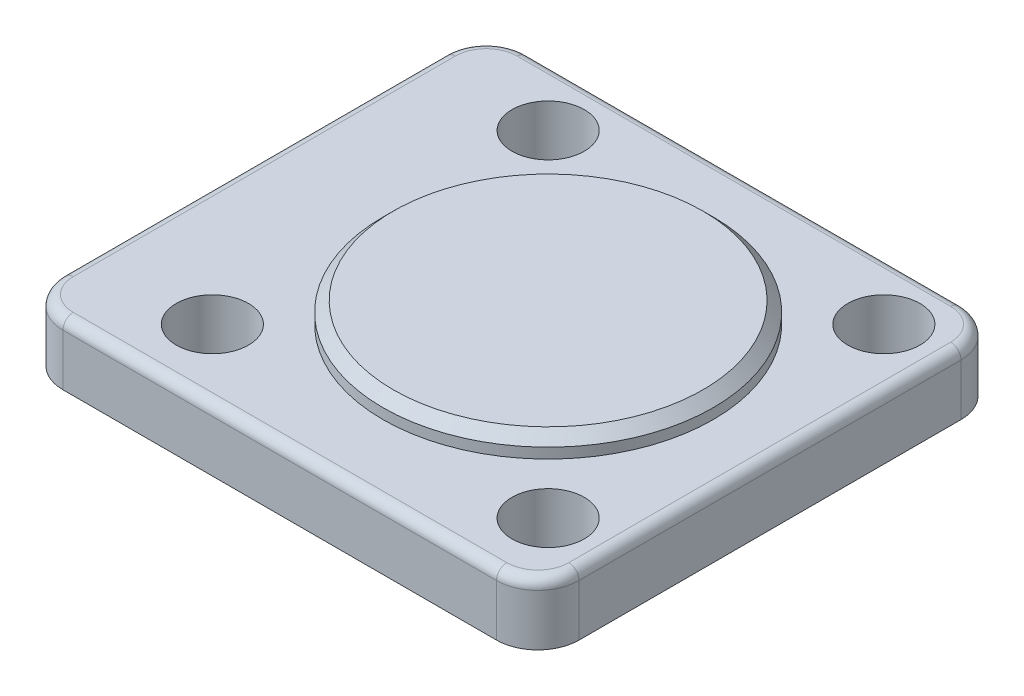
ISO-10303-21;
HEADER;
FILE_DESCRIPTION(('STEP AP214'),'2;1');
FILE_NAME('part.step','',(''),(''),'','','');
FILE_SCHEMA(('AUTOMOTIVE_DESIGN { 1 0 10303 214 1 1 1 1 }'));
ENDSEC;
DATA;
#1=APPLICATION_CONTEXT('core data for automotive mechanical design processes');
#2=APPLICATION_PROTOCOL_DEFINITION('international standard','automotive_design',2000,#1);
#3=PRODUCT_CONTEXT('',#1,'mechanical');
#4=PRODUCT('Part','Part','',(#3));
#5=PRODUCT_RELATED_PRODUCT_CATEGORY('part','',(#4));
#6=PRODUCT_DEFINITION_FORMATION('','',#4);
#7=PRODUCT_DEFINITION_CONTEXT('part definition',#1,'design');
#8=PRODUCT_DEFINITION('design','',#6,#7);
#9=PRODUCT_DEFINITION_SHAPE('','',#8);
#10=(LENGTH_UNIT() NAMED_UNIT(*) SI_UNIT(.MILLI.,.METRE.));
#11=(NAMED_UNIT(*) PLANE_ANGLE_UNIT() SI_UNIT($,.RADIAN.));
#12=(NAMED_UNIT(*) SI_UNIT($,.STERADIAN.) SOLID_ANGLE_UNIT());
#13=UNCERTAINTY_MEASURE_WITH_UNIT(LENGTH_MEASURE(1.E-05),#10,'distance_accuracy_value','');
#14=(GEOMETRIC_REPRESENTATION_CONTEXT(3) GLOBAL_UNCERTAINTY_ASSIGNED_CONTEXT((#13)) GLOBAL_UNIT_ASSIGNED_CONTEXT((#10,
#11,#12)) REPRESENTATION_CONTEXT('',''));
#15=CARTESIAN_POINT('',(0.,0.,0.));
#16=DIRECTION('',(0.,0.,1.));
#17=DIRECTION('',(1.,0.,0.));
#18=AXIS2_PLACEMENT_3D('',#15,#16,#17);
#19=CARTESIAN_POINT('',(18.,6.,-18.));
#20=DIRECTION('',(0.,-1.,0.));
#21=DIRECTION('',(0.,0.,-1.));
#22=AXIS2_PLACEMENT_3D('',#19,#20,#21);
#23=CYLINDRICAL_SURFACE('',#22,4.);
#24=DIRECTION('',(0.,-1.,0.));
#25=VECTOR('',#24,1.);
#26=CARTESIAN_POINT('',(18.,6.,-22.));
#27=LINE('',#26,#25);
#28=CARTESIAN_POINT('',(18.,5.,-22.));
#29=VERTEX_POINT('',#28);
#30=CARTESIAN_POINT('',(18.,0.,-22.));
#31=VERTEX_POINT('',#30);
#32=EDGE_CURVE('E125',#29,#31,#27,.T.);
#33=ORIENTED_EDGE('',*,*,#32,.F.);
#34=CARTESIAN_POINT('',(18.,5.,-18.));
#35=DIRECTION('',(0.,-1.,0.));
#36=DIRECTION('',(0.,0.,-1.));
#37=AXIS2_PLACEMENT_3D('',#34,#35,#36);
#38=CIRCLE('',#37,4.);
#39=CARTESIAN_POINT('',(22.,5.,-18.));
#40=VERTEX_POINT('',#39);
#41=EDGE_CURVE('E214',#29,#40,#38,.T.);
#42=ORIENTED_EDGE('',*,*,#41,.T.);
#43=DIRECTION('',(0.,-1.,0.));
#44=VECTOR('',#43,1.);
#45=CARTESIAN_POINT('',(22.,6.,-18.));
#46=LINE('',#45,#44);
#47=CARTESIAN_POINT('',(22.,0.,-18.));
#48=VERTEX_POINT('',#47);
#49=EDGE_CURVE('E149',#40,#48,#46,.T.);
#50=ORIENTED_EDGE('',*,*,#49,.T.);
#51=CARTESIAN_POINT('',(18.,0.,-18.));
#52=DIRECTION('',(0.,1.,0.));
#53=DIRECTION('',(0.,0.,-1.));
#54=AXIS2_PLACEMENT_3D('',#51,#52,#53);
#55=CIRCLE('',#54,4.);
#56=EDGE_CURVE('E143',#48,#31,#55,.T.);
#57=ORIENTED_EDGE('',*,*,#56,.T.);
#58=EDGE_LOOP('',(#33,#42,#50,#57));
#59=FACE_BOUND('',#58,.T.);
#60=ADVANCED_FACE('F35',(#59),#23,.T.);
#61=CARTESIAN_POINT('',(-24.,6.,-22.));
#62=DIRECTION('',(0.,0.,1.));
#63=DIRECTION('',(1.,0.,0.));
#64=AXIS2_PLACEMENT_3D('',#61,#62,#63);
#65=PLANE('',#64);
#66=DIRECTION('',(0.,-1.,0.));
#67=VECTOR('',#66,1.);
#68=CARTESIAN_POINT('',(-24.,6.,-22.));
#69=LINE('',#68,#67);
#70=CARTESIAN_POINT('',(-24.,5.,-22.));
#71=VERTEX_POINT('',#70);
#72=CARTESIAN_POINT('',(-24.,0.,-22.));
#73=VERTEX_POINT('',#72);
#74=EDGE_CURVE('E137',#71,#73,#69,.T.);
#75=ORIENTED_EDGE('',*,*,#74,.F.);
#76=DIRECTION('',(-1.,0.,0.));
#77=VECTOR('',#76,1.);
#78=CARTESIAN_POINT('',(-24.,5.,-22.));
#79=LINE('',#78,#77);
#80=EDGE_CURVE('E132',#71,#29,#79,.F.);
#81=ORIENTED_EDGE('',*,*,#80,.T.);
#82=ORIENTED_EDGE('',*,*,#32,.T.);
#83=DIRECTION('',(-1.,0.,0.));
#84=VECTOR('',#83,1.);
#85=CARTESIAN_POINT('',(-24.,0.,-22.));
#86=LINE('',#85,#84);
#87=EDGE_CURVE('E129',#31,#73,#86,.T.);
#88=ORIENTED_EDGE('',*,*,#87,.T.);
#89=EDGE_LOOP('',(#75,#81,#82,#88));
#90=FACE_BOUND('',#89,.T.);
#91=ADVANCED_FACE('F128',(#90),#65,.F.);
#92=CARTESIAN_POINT('',(-24.,6.,-18.));
#93=DIRECTION('',(0.,-1.,0.));
#94=DIRECTION('',(0.,0.,-1.));
#95=AXIS2_PLACEMENT_3D('',#92,#93,#94);
#96=CYLINDRICAL_SURFACE('',#95,4.);
#97=DIRECTION('',(0.,-1.,0.));
#98=VECTOR('',#97,1.);
#99=CARTESIAN_POINT('',(-28.,6.,-18.));
#100=LINE('',#99,#98);
#101=CARTESIAN_POINT('',(-28.,5.,-18.));
#102=VERTEX_POINT('',#101);
#103=CARTESIAN_POINT('',(-28.,0.,-18.));
#104=VERTEX_POINT('',#103);
#105=EDGE_CURVE('E182',#102,#104,#100,.T.);
#106=ORIENTED_EDGE('',*,*,#105,.F.);
#107=CARTESIAN_POINT('',(-24.,5.,-18.));
#108=DIRECTION('',(0.,-1.,0.));
#109=DIRECTION('',(0.,0.,-1.));
#110=AXIS2_PLACEMENT_3D('',#107,#108,#109);
#111=CIRCLE('',#110,4.);
#112=EDGE_CURVE('E210',#102,#71,#111,.T.);
#113=ORIENTED_EDGE('',*,*,#112,.T.);
#114=ORIENTED_EDGE('',*,*,#74,.T.);
#115=CARTESIAN_POINT('',(-24.,0.,-18.));
#116=DIRECTION('',(0.,1.,0.));
#117=DIRECTION('',(0.,0.,1.));
#118=AXIS2_PLACEMENT_3D('',#115,#116,#117);
#119=CIRCLE('',#118,4.);
#120=EDGE_CURVE('E146',#73,#104,#119,.T.);
#121=ORIENTED_EDGE('',*,*,#120,.T.);
#122=EDGE_LOOP('',(#106,#113,#114,#121));
#123=FACE_BOUND('',#122,.T.);
#124=ADVANCED_FACE('F295',(#123),#96,.T.);
#125=CARTESIAN_POINT('',(-28.,6.,-18.));
#126=DIRECTION('',(1.,0.,0.));
#127=DIRECTION('',(0.,0.,-1.));
#128=AXIS2_PLACEMENT_3D('',#125,#126,#127);
#129=PLANE('',#128);
#130=DIRECTION('',(0.,-1.,0.));
#131=VECTOR('',#130,1.);
#132=CARTESIAN_POINT('',(-28.,6.,19.));
#133=LINE('',#132,#131);
#134=CARTESIAN_POINT('',(-28.,5.,19.));
#135=VERTEX_POINT('',#134);
#136=CARTESIAN_POINT('',(-28.,0.,19.));
#137=VERTEX_POINT('',#136);
#138=EDGE_CURVE('E180',#135,#137,#133,.T.);
#139=ORIENTED_EDGE('',*,*,#138,.F.);
#140=DIRECTION('',(0.,0.,1.));
#141=VECTOR('',#140,1.);
#142=CARTESIAN_POINT('',(-28.,5.,-18.));
#143=LINE('',#142,#141);
#144=EDGE_CURVE('E11',#135,#102,#143,.F.);
#145=ORIENTED_EDGE('',*,*,#144,.T.);
#146=ORIENTED_EDGE('',*,*,#105,.T.);
#147=DIRECTION('',(0.,0.,1.));
#148=VECTOR('',#147,1.);
#149=CARTESIAN_POINT('',(-28.,0.,-18.));
#150=LINE('',#149,#148);
#151=EDGE_CURVE('E159',#104,#137,#150,.T.);
#152=ORIENTED_EDGE('',*,*,#151,.T.);
#153=EDGE_LOOP('',(#139,#145,#146,#152));
#154=FACE_BOUND('',#153,.T.);
#155=ADVANCED_FACE('F347',(#154),#129,.F.);
#156=CARTESIAN_POINT('',(-24.,6.,19.));
#157=DIRECTION('',(0.,-1.,0.));
#158=DIRECTION('',(0.,0.,-1.));
#159=AXIS2_PLACEMENT_3D('',#156,#157,#158);
#160=CYLINDRICAL_SURFACE('',#159,4.);
#161=DIRECTION('',(0.,-1.,0.));
#162=VECTOR('',#161,1.);
#163=CARTESIAN_POINT('',(-24.,6.,23.));
#164=LINE('',#163,#162);
#165=CARTESIAN_POINT('',(-24.,5.,23.));
#166=VERTEX_POINT('',#165);
#167=CARTESIAN_POINT('',(-24.,0.,23.));
#168=VERTEX_POINT('',#167);
#169=EDGE_CURVE('E178',#166,#168,#164,.T.);
#170=ORIENTED_EDGE('',*,*,#169,.F.);
#171=CARTESIAN_POINT('',(-24.,5.,19.));
#172=DIRECTION('',(0.,-1.,0.));
#173=DIRECTION('',(0.,0.,-1.));
#174=AXIS2_PLACEMENT_3D('',#171,#172,#173);
#175=CIRCLE('',#174,4.);
#176=EDGE_CURVE('E44',#166,#135,#175,.T.);
#177=ORIENTED_EDGE('',*,*,#176,.T.);
#178=ORIENTED_EDGE('',*,*,#138,.T.);
#179=CARTESIAN_POINT('',(-24.,0.,19.));
#180=DIRECTION('',(0.,1.,0.));
#181=DIRECTION('',(0.,0.,1.));
#182=AXIS2_PLACEMENT_3D('',#179,#180,#181);
#183=CIRCLE('',#182,4.);
#184=EDGE_CURVE('E162',#137,#168,#183,.T.);
#185=ORIENTED_EDGE('',*,*,#184,.T.);
#186=EDGE_LOOP('',(#170,#177,#178,#185));
#187=FACE_BOUND('',#186,.T.);
#188=ADVANCED_FACE('F362',(#187),#160,.T.);
#189=CARTESIAN_POINT('',(-24.,6.,23.));
#190=DIRECTION('',(0.,0.,-1.));
#191=DIRECTION('',(-1.,0.,0.));
#192=AXIS2_PLACEMENT_3D('',#189,#190,#191);
#193=PLANE('',#192);
#194=DIRECTION('',(0.,-1.,0.));
#195=VECTOR('',#194,1.);
#196=CARTESIAN_POINT('',(18.,6.,23.));
#197=LINE('',#196,#195);
#198=CARTESIAN_POINT('',(18.,5.,23.));
#199=VERTEX_POINT('',#198);
#200=CARTESIAN_POINT('',(18.,0.,23.));
#201=VERTEX_POINT('',#200);
#202=EDGE_CURVE('E176',#199,#201,#197,.T.);
#203=ORIENTED_EDGE('',*,*,#202,.F.);
#204=DIRECTION('',(1.,0.,0.));
#205=VECTOR('',#204,1.);
#206=CARTESIAN_POINT('',(-24.,5.,23.));
#207=LINE('',#206,#205);
#208=EDGE_CURVE('E59',#199,#166,#207,.F.);
#209=ORIENTED_EDGE('',*,*,#208,.T.);
#210=ORIENTED_EDGE('',*,*,#169,.T.);
#211=DIRECTION('',(1.,0.,0.));
#212=VECTOR('',#211,1.);
#213=CARTESIAN_POINT('',(-24.,0.,23.));
#214=LINE('',#213,#212);
#215=EDGE_CURVE('E165',#168,#201,#214,.T.);
#216=ORIENTED_EDGE('',*,*,#215,.T.);
#217=EDGE_LOOP('',(#203,#209,#210,#216));
#218=FACE_BOUND('',#217,.T.);
#219=ADVANCED_FACE('F361',(#218),#193,.F.);
#220=CARTESIAN_POINT('',(18.,6.,19.));
#221=DIRECTION('',(0.,-1.,0.));
#222=DIRECTION('',(0.,0.,-1.));
#223=AXIS2_PLACEMENT_3D('',#220,#221,#222);
#224=CYLINDRICAL_SURFACE('',#223,4.);
#225=DIRECTION('',(0.,-1.,0.));
#226=VECTOR('',#225,1.);
#227=CARTESIAN_POINT('',(22.,6.,19.));
#228=LINE('',#227,#226);
#229=CARTESIAN_POINT('',(22.,5.,19.));
#230=VERTEX_POINT('',#229);
#231=CARTESIAN_POINT('',(22.,0.,19.));
#232=VERTEX_POINT('',#231);
#233=EDGE_CURVE('E174',#230,#232,#228,.T.);
#234=ORIENTED_EDGE('',*,*,#233,.F.);
#235=CARTESIAN_POINT('',(18.,5.,19.));
#236=DIRECTION('',(0.,-1.,0.));
#237=DIRECTION('',(0.,0.,-1.));
#238=AXIS2_PLACEMENT_3D('',#235,#236,#237);
#239=CIRCLE('',#238,4.);
#240=EDGE_CURVE('E218',#230,#199,#239,.T.);
#241=ORIENTED_EDGE('',*,*,#240,.T.);
#242=ORIENTED_EDGE('',*,*,#202,.T.);
#243=CARTESIAN_POINT('',(18.,0.,19.));
#244=DIRECTION('',(0.,1.,0.));
#245=DIRECTION('',(0.,0.,1.));
#246=AXIS2_PLACEMENT_3D('',#243,#244,#245);
#247=CIRCLE('',#246,4.);
#248=EDGE_CURVE('E168',#201,#232,#247,.T.);
#249=ORIENTED_EDGE('',*,*,#248,.T.);
#250=EDGE_LOOP('',(#234,#241,#242,#249));
#251=FACE_BOUND('',#250,.T.);
#252=ADVANCED_FACE('F285',(#251),#224,.T.);
#253=CARTESIAN_POINT('',(22.,6.,-18.));
#254=DIRECTION('',(-1.,0.,0.));
#255=DIRECTION('',(0.,0.,1.));
#256=AXIS2_PLACEMENT_3D('',#253,#254,#255);
#257=PLANE('',#256);
#258=ORIENTED_EDGE('',*,*,#49,.F.);
#259=DIRECTION('',(0.,0.,-1.));
#260=VECTOR('',#259,1.);
#261=CARTESIAN_POINT('',(22.,5.,-18.));
#262=LINE('',#261,#260);
#263=EDGE_CURVE('E216',#40,#230,#262,.F.);
#264=ORIENTED_EDGE('',*,*,#263,.T.);
#265=ORIENTED_EDGE('',*,*,#233,.T.);
#266=DIRECTION('',(0.,0.,-1.));
#267=VECTOR('',#266,1.);
#268=CARTESIAN_POINT('',(22.,0.,-18.));
#269=LINE('',#268,#267);
#270=EDGE_CURVE('E171',#232,#48,#269,.T.);
#271=ORIENTED_EDGE('',*,*,#270,.T.);
#272=EDGE_LOOP('',(#258,#264,#265,#271));
#273=FACE_BOUND('',#272,.T.);
#274=ADVANCED_FACE('F276',(#273),#257,.F.);
#275=CARTESIAN_POINT('',(18.,6.,-18.));
#276=DIRECTION('',(0.,-1.,0.));
#277=DIRECTION('',(0.,0.,-1.));
#278=AXIS2_PLACEMENT_3D('',#275,#276,#277);
#279=PLANE('',#278);
#280=DIRECTION('',(-1.,0.,0.));
#281=VECTOR('',#280,1.);
#282=CARTESIAN_POINT('',(18.,6.,-21.));
#283=LINE('',#282,#281);
#284=CARTESIAN_POINT('',(18.,6.,-21.));
#285=VERTEX_POINT('',#284);
#286=CARTESIAN_POINT('',(-24.,6.,-21.));
#287=VERTEX_POINT('',#286);
#288=EDGE_CURVE('E205',#285,#287,#283,.T.);
#289=ORIENTED_EDGE('',*,*,#288,.T.);
#290=CARTESIAN_POINT('',(-24.,6.,-18.));
#291=DIRECTION('',(0.,-1.,0.));
#292=DIRECTION('',(0.,0.,-1.));
#293=AXIS2_PLACEMENT_3D('',#290,#291,#292);
#294=CIRCLE('',#293,3.);
#295=CARTESIAN_POINT('',(-27.,6.,-18.));
#296=VERTEX_POINT('',#295);
#297=EDGE_CURVE('E207',#287,#296,#294,.F.);
#298=ORIENTED_EDGE('',*,*,#297,.T.);
#299=DIRECTION('',(0.,0.,1.));
#300=VECTOR('',#299,1.);
#301=CARTESIAN_POINT('',(-27.,6.,-18.));
#302=LINE('',#301,#300);
#303=CARTESIAN_POINT('',(-27.,6.,19.));
#304=VERTEX_POINT('',#303);
#305=EDGE_CURVE('E193',#296,#304,#302,.T.);
#306=ORIENTED_EDGE('',*,*,#305,.T.);
#307=CARTESIAN_POINT('',(-24.,6.,19.));
#308=DIRECTION('',(0.,-1.,0.));
#309=DIRECTION('',(0.,0.,-1.));
#310=AXIS2_PLACEMENT_3D('',#307,#308,#309);
#311=CIRCLE('',#310,3.);
#312=CARTESIAN_POINT('',(-24.,6.,22.));
#313=VERTEX_POINT('',#312);
#314=EDGE_CURVE('E195',#304,#313,#311,.F.);
#315=ORIENTED_EDGE('',*,*,#314,.T.);
#316=DIRECTION('',(1.,0.,0.));
#317=VECTOR('',#316,1.);
#318=CARTESIAN_POINT('',(18.,6.,22.));
#319=LINE('',#318,#317);
#320=CARTESIAN_POINT('',(18.,6.,22.));
#321=VERTEX_POINT('',#320);
#322=EDGE_CURVE('E197',#313,#321,#319,.T.);
#323=ORIENTED_EDGE('',*,*,#322,.T.);
#324=CARTESIAN_POINT('',(18.,6.,19.));
#325=DIRECTION('',(0.,-1.,0.));
#326=DIRECTION('',(0.,0.,-1.));
#327=AXIS2_PLACEMENT_3D('',#324,#325,#326);
#328=CIRCLE('',#327,3.);
#329=CARTESIAN_POINT('',(21.,6.,19.));
#330=VERTEX_POINT('',#329);
#331=EDGE_CURVE('E199',#321,#330,#328,.F.);
#332=ORIENTED_EDGE('',*,*,#331,.T.);
#333=DIRECTION('',(0.,0.,-1.));
#334=VECTOR('',#333,1.);
#335=CARTESIAN_POINT('',(21.,6.,-18.));
#336=LINE('',#335,#334);
#337=CARTESIAN_POINT('',(21.,6.,-18.));
#338=VERTEX_POINT('',#337);
#339=EDGE_CURVE('E201',#330,#338,#336,.T.);
#340=ORIENTED_EDGE('',*,*,#339,.T.);
#341=CARTESIAN_POINT('',(18.,6.,-18.));
#342=DIRECTION('',(0.,-1.,0.));
#343=DIRECTION('',(0.,0.,-1.));
#344=AXIS2_PLACEMENT_3D('',#341,#342,#343);
#345=CIRCLE('',#344,3.);
#346=EDGE_CURVE('E203',#338,#285,#345,.F.);
#347=ORIENTED_EDGE('',*,*,#346,.T.);
#348=EDGE_LOOP('',(#289,#298,#306,#315,#323,#332,#340,#347));
#349=FACE_BOUND('',#348,.T.);
#350=CARTESIAN_POINT('',(0.,6.,0.));
#351=DIRECTION('',(0.,-1.,0.));
#352=DIRECTION('',(0.,0.,-1.));
#353=AXIS2_PLACEMENT_3D('',#350,#351,#352);
#354=CIRCLE('',#353,16.);
#355=CARTESIAN_POINT('',(0.,6.,-16.));
#356=VERTEX_POINT('',#355);
#357=EDGE_CURVE('E136',#356,#356,#354,.F.);
#358=ORIENTED_EDGE('',*,*,#357,.F.);
#359=EDGE_LOOP('',(#358));
#360=FACE_BOUND('',#359,.T.);
#361=CARTESIAN_POINT('',(-16.2634559672905,6.,-16.2634559672898));
#362=DIRECTION('',(0.,1.,0.));
#363=DIRECTION('',(0.,0.,1.));
#364=AXIS2_PLACEMENT_3D('',#361,#362,#363);
#365=CIRCLE('',#364,3.50000000000096);
#366=CARTESIAN_POINT('',(-16.2634559672905,6.,-12.7634559672888));
#367=VERTEX_POINT('',#366);
#368=EDGE_CURVE('E243',#367,#367,#365,.T.);
#369=ORIENTED_EDGE('',*,*,#368,.F.);
#370=EDGE_LOOP('',(#369));
#371=FACE_BOUND('',#370,.T.);
#372=CARTESIAN_POINT('',(-16.2634559672898,6.,16.2634559672914));
#373=DIRECTION('',(0.,1.,0.));
#374=DIRECTION('',(0.,0.,1.));
#375=AXIS2_PLACEMENT_3D('',#372,#373,#374);
#376=CIRCLE('',#375,3.50000000000067);
#377=CARTESIAN_POINT('',(-16.2634559672898,6.,19.7634559672921));
#378=VERTEX_POINT('',#377);
#379=EDGE_CURVE('E254',#378,#378,#376,.T.);
#380=ORIENTED_EDGE('',*,*,#379,.F.);
#381=EDGE_LOOP('',(#380));
#382=FACE_BOUND('',#381,.T.);
#383=CARTESIAN_POINT('',(16.2634559672914,6.,16.2634559672907));
#384=DIRECTION('',(0.,1.,0.));
#385=DIRECTION('',(0.,0.,1.));
#386=AXIS2_PLACEMENT_3D('',#383,#384,#385);
#387=CIRCLE('',#386,3.49999999999977);
#388=CARTESIAN_POINT('',(16.2634559672914,6.,19.7634559672904));
#389=VERTEX_POINT('',#388);
#390=EDGE_CURVE('E262',#389,#389,#387,.T.);
#391=ORIENTED_EDGE('',*,*,#390,.F.);
#392=EDGE_LOOP('',(#391));
#393=FACE_BOUND('',#392,.T.);
#394=CARTESIAN_POINT('',(16.2634559672907,6.,-16.2634559672905));
#395=DIRECTION('',(0.,1.,0.));
#396=DIRECTION('',(0.,0.,1.));
#397=AXIS2_PLACEMENT_3D('',#394,#395,#396);
#398=CIRCLE('',#397,3.5);
#399=CARTESIAN_POINT('',(16.2634559672907,6.,-12.7634559672905));
#400=VERTEX_POINT('',#399);
#401=EDGE_CURVE('E154',#400,#400,#398,.T.);
#402=ORIENTED_EDGE('',*,*,#401,.F.);
#403=EDGE_LOOP('',(#402));
#404=FACE_BOUND('',#403,.T.);
#405=ADVANCED_FACE('F274',(#349,#360,#371,#382,#393,#404),#279,.F.);
#406=CARTESIAN_POINT('',(18.,0.,-18.));
#407=DIRECTION('',(0.,-1.,0.));
#408=DIRECTION('',(0.,0.,-1.));
#409=AXIS2_PLACEMENT_3D('',#406,#407,#408);
#410=PLANE('',#409);
#411=CARTESIAN_POINT('',(-16.2634559672905,0.,-16.2634559672898));
#412=DIRECTION('',(0.,1.,0.));
#413=DIRECTION('',(0.,0.,1.));
#414=AXIS2_PLACEMENT_3D('',#411,#412,#413);
#415=CIRCLE('',#414,3.50000000000096);
#416=CARTESIAN_POINT('',(-16.2634559672905,0.,-12.7634559672888));
#417=VERTEX_POINT('',#416);
#418=EDGE_CURVE('E249',#417,#417,#415,.T.);
#419=ORIENTED_EDGE('',*,*,#418,.T.);
#420=EDGE_LOOP('',(#419));
#421=FACE_BOUND('',#420,.T.);
#422=CARTESIAN_POINT('',(-16.2634559672898,0.,16.2634559672914));
#423=DIRECTION('',(0.,1.,0.));
#424=DIRECTION('',(0.,0.,1.));
#425=AXIS2_PLACEMENT_3D('',#422,#423,#424);
#426=CIRCLE('',#425,3.50000000000067);
#427=CARTESIAN_POINT('',(-16.2634559672898,0.,19.7634559672921));
#428=VERTEX_POINT('',#427);
#429=EDGE_CURVE('E259',#428,#428,#426,.T.);
#430=ORIENTED_EDGE('',*,*,#429,.T.);
#431=EDGE_LOOP('',(#430));
#432=FACE_BOUND('',#431,.T.);
#433=CARTESIAN_POINT('',(16.2634559672914,0.,16.2634559672907));
#434=DIRECTION('',(0.,1.,0.));
#435=DIRECTION('',(0.,0.,1.));
#436=AXIS2_PLACEMENT_3D('',#433,#434,#435);
#437=CIRCLE('',#436,3.49999999999977);
#438=CARTESIAN_POINT('',(16.2634559672914,0.,19.7634559672904));
#439=VERTEX_POINT('',#438);
#440=EDGE_CURVE('E265',#439,#439,#437,.T.);
#441=ORIENTED_EDGE('',*,*,#440,.T.);
#442=EDGE_LOOP('',(#441));
#443=FACE_BOUND('',#442,.T.);
#444=CARTESIAN_POINT('',(16.2634559672907,0.,-16.2634559672905));
#445=DIRECTION('',(0.,1.,0.));
#446=DIRECTION('',(0.,0.,1.));
#447=AXIS2_PLACEMENT_3D('',#444,#445,#446);
#448=CIRCLE('',#447,3.5);
#449=CARTESIAN_POINT('',(16.2634559672907,0.,-12.7634559672905));
#450=VERTEX_POINT('',#449);
#451=EDGE_CURVE('E151',#450,#450,#448,.T.);
#452=ORIENTED_EDGE('',*,*,#451,.T.);
#453=EDGE_LOOP('',(#452));
#454=FACE_BOUND('',#453,.T.);
#455=ORIENTED_EDGE('',*,*,#56,.F.);
#456=ORIENTED_EDGE('',*,*,#270,.F.);
#457=ORIENTED_EDGE('',*,*,#248,.F.);
#458=ORIENTED_EDGE('',*,*,#215,.F.);
#459=ORIENTED_EDGE('',*,*,#184,.F.);
#460=ORIENTED_EDGE('',*,*,#151,.F.);
#461=ORIENTED_EDGE('',*,*,#120,.F.);
#462=ORIENTED_EDGE('',*,*,#87,.F.);
#463=EDGE_LOOP('',(#455,#456,#457,#458,#459,#460,#461,#462));
#464=FACE_BOUND('',#463,.T.);
#465=ADVANCED_FACE('F141',(#421,#432,#443,#454,#464),#410,.T.);
#466=CARTESIAN_POINT('',(16.2634559672907,0.,-16.2634559672905));
#467=DIRECTION('',(0.,1.,0.));
#468=DIRECTION('',(0.,0.,1.));
#469=AXIS2_PLACEMENT_3D('',#466,#467,#468);
#470=CYLINDRICAL_SURFACE('',#469,3.5);
#471=ORIENTED_EDGE('',*,*,#451,.F.);
#472=EDGE_LOOP('',(#471));
#473=FACE_BOUND('',#472,.T.);
#474=ORIENTED_EDGE('',*,*,#401,.T.);
#475=EDGE_LOOP('',(#474));
#476=FACE_BOUND('',#475,.T.);
#477=ADVANCED_FACE('F272',(#473,#476),#470,.F.);
#478=CARTESIAN_POINT('',(16.2634559672914,0.,16.2634559672907));
#479=DIRECTION('',(0.,1.,0.));
#480=DIRECTION('',(0.,0.,1.));
#481=AXIS2_PLACEMENT_3D('',#478,#479,#480);
#482=CYLINDRICAL_SURFACE('',#481,3.49999999999977);
#483=ORIENTED_EDGE('',*,*,#440,.F.);
#484=EDGE_LOOP('',(#483));
#485=FACE_BOUND('',#484,.T.);
#486=ORIENTED_EDGE('',*,*,#390,.T.);
#487=EDGE_LOOP('',(#486));
#488=FACE_BOUND('',#487,.T.);
#489=ADVANCED_FACE('F495',(#485,#488),#482,.F.);
#490=CARTESIAN_POINT('',(-16.2634559672898,0.,16.2634559672914));
#491=DIRECTION('',(0.,1.,0.));
#492=DIRECTION('',(0.,0.,1.));
#493=AXIS2_PLACEMENT_3D('',#490,#491,#492);
#494=CYLINDRICAL_SURFACE('',#493,3.50000000000067);
#495=ORIENTED_EDGE('',*,*,#429,.F.);
#496=EDGE_LOOP('',(#495));
#497=FACE_BOUND('',#496,.T.);
#498=ORIENTED_EDGE('',*,*,#379,.T.);
#499=EDGE_LOOP('',(#498));
#500=FACE_BOUND('',#499,.T.);
#501=ADVANCED_FACE('F486',(#497,#500),#494,.F.);
#502=CARTESIAN_POINT('',(-16.2634559672905,0.,-16.2634559672898));
#503=DIRECTION('',(0.,1.,0.));
#504=DIRECTION('',(0.,0.,1.));
#505=AXIS2_PLACEMENT_3D('',#502,#503,#504);
#506=CYLINDRICAL_SURFACE('',#505,3.50000000000096);
#507=ORIENTED_EDGE('',*,*,#418,.F.);
#508=EDGE_LOOP('',(#507));
#509=FACE_BOUND('',#508,.T.);
#510=ORIENTED_EDGE('',*,*,#368,.T.);
#511=EDGE_LOOP('',(#510));
#512=FACE_BOUND('',#511,.T.);
#513=ADVANCED_FACE('F477',(#509,#512),#506,.F.);
#514=CARTESIAN_POINT('',(0.,8.,0.));
#515=DIRECTION('',(0.,-1.,0.));
#516=DIRECTION('',(0.,0.,-1.));
#517=AXIS2_PLACEMENT_3D('',#514,#515,#516);
#518=CYLINDRICAL_SURFACE('',#517,16.);
#519=CARTESIAN_POINT('',(0.,7.,0.));
#520=DIRECTION('',(0.,1.,0.));
#521=DIRECTION('',(0.,0.,1.));
#522=AXIS2_PLACEMENT_3D('',#519,#520,#521);
#523=CIRCLE('',#522,16.);
#524=CARTESIAN_POINT('',(0.,7.,16.));
#525=VERTEX_POINT('',#524);
#526=EDGE_CURVE('E190',#525,#525,#523,.F.);
#527=ORIENTED_EDGE('',*,*,#526,.T.);
#528=EDGE_LOOP('',(#527));
#529=FACE_BOUND('',#528,.T.);
#530=ORIENTED_EDGE('',*,*,#357,.T.);
#531=EDGE_LOOP('',(#530));
#532=FACE_BOUND('',#531,.T.);
#533=ADVANCED_FACE('F468',(#529,#532),#518,.T.);
#534=CARTESIAN_POINT('',(0.,8.,0.));
#535=DIRECTION('',(0.,1.,0.));
#536=DIRECTION('',(0.,0.,1.));
#537=AXIS2_PLACEMENT_3D('',#534,#535,#536);
#538=PLANE('',#537);
#539=CARTESIAN_POINT('',(0.,8.,0.));
#540=DIRECTION('',(0.,1.,0.));
#541=DIRECTION('',(0.,0.,1.));
#542=AXIS2_PLACEMENT_3D('',#539,#540,#541);
#543=CIRCLE('',#542,15.);
#544=CARTESIAN_POINT('',(0.,8.,15.));
#545=VERTEX_POINT('',#544);
#546=EDGE_CURVE('E187',#545,#545,#543,.T.);
#547=ORIENTED_EDGE('',*,*,#546,.T.);
#548=EDGE_LOOP('',(#547));
#549=FACE_BOUND('',#548,.T.);
#550=ADVANCED_FACE('F305',(#549),#538,.T.);
#551=CARTESIAN_POINT('',(0.,8.,0.));
#552=DIRECTION('',(0.,-1.,0.));
#553=DIRECTION('',(0.,0.,-1.));
#554=AXIS2_PLACEMENT_3D('',#551,#552,#553);
#555=CONICAL_SURFACE('',#554,15.,0.785398163397448);
#556=ORIENTED_EDGE('',*,*,#526,.F.);
#557=EDGE_LOOP('',(#556));
#558=FACE_BOUND('',#557,.T.);
#559=ORIENTED_EDGE('',*,*,#546,.F.);
#560=EDGE_LOOP('',(#559));
#561=FACE_BOUND('',#560,.T.);
#562=ADVANCED_FACE('F300',(#558,#561),#555,.T.);
#563=CARTESIAN_POINT('',(18.,5.,19.));
#564=DIRECTION('',(0.,-1.,0.));
#565=DIRECTION('',(0.,0.,-1.));
#566=AXIS2_PLACEMENT_3D('',#563,#564,#565);
#567=TOROIDAL_SURFACE('',#566,3.,1.);
#568=CARTESIAN_POINT('',(18.,5.,22.));
#569=DIRECTION('',(-1.,0.,0.));
#570=DIRECTION('',(0.,0.,1.));
#571=AXIS2_PLACEMENT_3D('',#568,#569,#570);
#572=CIRCLE('',#571,1.);
#573=EDGE_CURVE('E237',#199,#321,#572,.T.);
#574=ORIENTED_EDGE('',*,*,#573,.F.);
#575=ORIENTED_EDGE('',*,*,#240,.F.);
#576=CARTESIAN_POINT('',(21.,5.,19.));
#577=DIRECTION('',(0.,0.,-1.));
#578=DIRECTION('',(-1.,0.,0.));
#579=AXIS2_PLACEMENT_3D('',#576,#577,#578);
#580=CIRCLE('',#579,1.);
#581=EDGE_CURVE('E39',#330,#230,#580,.T.);
#582=ORIENTED_EDGE('',*,*,#581,.F.);
#583=ORIENTED_EDGE('',*,*,#331,.F.);
#584=EDGE_LOOP('',(#574,#575,#582,#583));
#585=FACE_BOUND('',#584,.T.);
#586=ADVANCED_FACE('F37',(#585),#567,.T.);
#587=CARTESIAN_POINT('',(21.,5.,-18.));
#588=DIRECTION('',(0.,0.,-1.));
#589=DIRECTION('',(-1.,0.,0.));
#590=AXIS2_PLACEMENT_3D('',#587,#588,#589);
#591=CYLINDRICAL_SURFACE('',#590,1.);
#592=ORIENTED_EDGE('',*,*,#581,.T.);
#593=ORIENTED_EDGE('',*,*,#263,.F.);
#594=CARTESIAN_POINT('',(21.,5.,-18.));
#595=DIRECTION('',(0.,0.,-1.));
#596=DIRECTION('',(-1.,0.,0.));
#597=AXIS2_PLACEMENT_3D('',#594,#595,#596);
#598=CIRCLE('',#597,1.);
#599=EDGE_CURVE('E235',#338,#40,#598,.T.);
#600=ORIENTED_EDGE('',*,*,#599,.F.);
#601=ORIENTED_EDGE('',*,*,#339,.F.);
#602=EDGE_LOOP('',(#592,#593,#600,#601));
#603=FACE_BOUND('',#602,.T.);
#604=ADVANCED_FACE('F329',(#603),#591,.T.);
#605=CARTESIAN_POINT('',(18.,5.,22.));
#606=DIRECTION('',(1.,0.,0.));
#607=DIRECTION('',(0.,0.,-1.));
#608=AXIS2_PLACEMENT_3D('',#605,#606,#607);
#609=CYLINDRICAL_SURFACE('',#608,1.);
#610=ORIENTED_EDGE('',*,*,#573,.T.);
#611=ORIENTED_EDGE('',*,*,#322,.F.);
#612=CARTESIAN_POINT('',(-24.,5.,22.));
#613=DIRECTION('',(-1.,0.,0.));
#614=DIRECTION('',(0.,0.,1.));
#615=AXIS2_PLACEMENT_3D('',#612,#613,#614);
#616=CIRCLE('',#615,1.);
#617=EDGE_CURVE('E232',#166,#313,#616,.T.);
#618=ORIENTED_EDGE('',*,*,#617,.F.);
#619=ORIENTED_EDGE('',*,*,#208,.F.);
#620=EDGE_LOOP('',(#610,#611,#618,#619));
#621=FACE_BOUND('',#620,.T.);
#622=ADVANCED_FACE('F326',(#621),#609,.T.);
#623=CARTESIAN_POINT('',(18.,5.,-18.));
#624=DIRECTION('',(0.,-1.,0.));
#625=DIRECTION('',(0.,0.,-1.));
#626=AXIS2_PLACEMENT_3D('',#623,#624,#625);
#627=TOROIDAL_SURFACE('',#626,3.,1.);
#628=ORIENTED_EDGE('',*,*,#599,.T.);
#629=ORIENTED_EDGE('',*,*,#41,.F.);
#630=CARTESIAN_POINT('',(18.,5.,-21.));
#631=DIRECTION('',(-1.,0.,0.));
#632=DIRECTION('',(0.,0.,1.));
#633=AXIS2_PLACEMENT_3D('',#630,#631,#632);
#634=CIRCLE('',#633,1.);
#635=EDGE_CURVE('E229',#285,#29,#634,.T.);
#636=ORIENTED_EDGE('',*,*,#635,.F.);
#637=ORIENTED_EDGE('',*,*,#346,.F.);
#638=EDGE_LOOP('',(#628,#629,#636,#637));
#639=FACE_BOUND('',#638,.T.);
#640=ADVANCED_FACE('F322',(#639),#627,.T.);
#641=CARTESIAN_POINT('',(-24.,5.,19.));
#642=DIRECTION('',(0.,-1.,0.));
#643=DIRECTION('',(0.,0.,-1.));
#644=AXIS2_PLACEMENT_3D('',#641,#642,#643);
#645=TOROIDAL_SURFACE('',#644,3.,1.);
#646=ORIENTED_EDGE('',*,*,#617,.T.);
#647=ORIENTED_EDGE('',*,*,#314,.F.);
#648=CARTESIAN_POINT('',(-27.,5.,19.));
#649=DIRECTION('',(0.,0.,-1.));
#650=DIRECTION('',(-1.,0.,0.));
#651=AXIS2_PLACEMENT_3D('',#648,#649,#650);
#652=CIRCLE('',#651,1.);
#653=EDGE_CURVE('E226',#135,#304,#652,.T.);
#654=ORIENTED_EDGE('',*,*,#653,.F.);
#655=ORIENTED_EDGE('',*,*,#176,.F.);
#656=EDGE_LOOP('',(#646,#647,#654,#655));
#657=FACE_BOUND('',#656,.T.);
#658=ADVANCED_FACE('F318',(#657),#645,.T.);
#659=CARTESIAN_POINT('',(18.,5.,-21.));
#660=DIRECTION('',(-1.,0.,0.));
#661=DIRECTION('',(0.,0.,1.));
#662=AXIS2_PLACEMENT_3D('',#659,#660,#661);
#663=CYLINDRICAL_SURFACE('',#662,1.);
#664=ORIENTED_EDGE('',*,*,#635,.T.);
#665=ORIENTED_EDGE('',*,*,#80,.F.);
#666=CARTESIAN_POINT('',(-24.,5.,-21.));
#667=DIRECTION('',(-1.,0.,0.));
#668=DIRECTION('',(0.,0.,1.));
#669=AXIS2_PLACEMENT_3D('',#666,#667,#668);
#670=CIRCLE('',#669,1.);
#671=EDGE_CURVE('E224',#287,#71,#670,.T.);
#672=ORIENTED_EDGE('',*,*,#671,.F.);
#673=ORIENTED_EDGE('',*,*,#288,.F.);
#674=EDGE_LOOP('',(#664,#665,#672,#673));
#675=FACE_BOUND('',#674,.T.);
#676=ADVANCED_FACE('F314',(#675),#663,.T.);
#677=CARTESIAN_POINT('',(-27.,5.,-18.));
#678=DIRECTION('',(0.,0.,1.));
#679=DIRECTION('',(1.,0.,0.));
#680=AXIS2_PLACEMENT_3D('',#677,#678,#679);
#681=CYLINDRICAL_SURFACE('',#680,1.);
#682=ORIENTED_EDGE('',*,*,#653,.T.);
#683=ORIENTED_EDGE('',*,*,#305,.F.);
#684=CARTESIAN_POINT('',(-27.,5.,-18.));
#685=DIRECTION('',(0.,0.,-1.));
#686=DIRECTION('',(0.,1.,0.));
#687=AXIS2_PLACEMENT_3D('',#684,#685,#686);
#688=CIRCLE('',#687,1.);
#689=EDGE_CURVE('E222',#102,#296,#688,.T.);
#690=ORIENTED_EDGE('',*,*,#689,.F.);
#691=ORIENTED_EDGE('',*,*,#144,.F.);
#692=EDGE_LOOP('',(#682,#683,#690,#691));
#693=FACE_BOUND('',#692,.T.);
#694=ADVANCED_FACE('F310',(#693),#681,.T.);
#695=CARTESIAN_POINT('',(-24.,5.,-18.));
#696=DIRECTION('',(0.,-1.,0.));
#697=DIRECTION('',(0.,0.,-1.));
#698=AXIS2_PLACEMENT_3D('',#695,#696,#697);
#699=TOROIDAL_SURFACE('',#698,3.,1.);
#700=ORIENTED_EDGE('',*,*,#671,.T.);
#701=ORIENTED_EDGE('',*,*,#112,.F.);
#702=ORIENTED_EDGE('',*,*,#689,.T.);
#703=ORIENTED_EDGE('',*,*,#297,.F.);
#704=EDGE_LOOP('',(#700,#701,#702,#703));
#705=FACE_BOUND('',#704,.T.);
#706=ADVANCED_FACE('F307',(#705),#699,.T.);
#707=CLOSED_SHELL('',(#60,#91,#124,#155,#188,#219,#252,#274,#405,#465,#477,#489,#501,#513,#533,
#550,#562,#586,#604,#622,#640,#658,#676,#694,#706));
#708=MANIFOLD_SOLID_BREP('B2',#707);
#709=ADVANCED_BREP_SHAPE_REPRESENTATION('',(#18,#708),#14);
#710=SHAPE_DEFINITION_REPRESENTATION(#9,#709);
ENDSEC;
END-ISO-10303-21;
